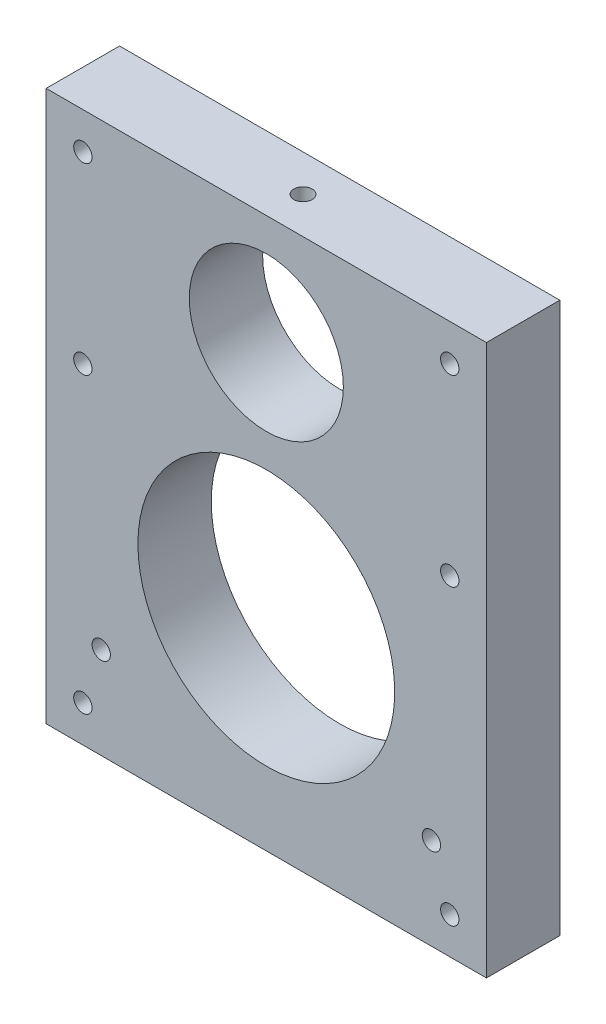
ISO-10303-21;
HEADER;
FILE_DESCRIPTION(('STEP AP214'),'2;1');
FILE_NAME('part.step','',(''),(''),'','','');
FILE_SCHEMA(('AUTOMOTIVE_DESIGN { 1 0 10303 214 1 1 1 1 }'));
ENDSEC;
DATA;
#1=APPLICATION_CONTEXT('core data for automotive mechanical design processes');
#2=APPLICATION_PROTOCOL_DEFINITION('international standard','automotive_design',2000,#1);
#3=PRODUCT_CONTEXT('',#1,'mechanical');
#4=PRODUCT('Part','Part','',(#3));
#5=PRODUCT_RELATED_PRODUCT_CATEGORY('part','',(#4));
#6=PRODUCT_DEFINITION_FORMATION('','',#4);
#7=PRODUCT_DEFINITION_CONTEXT('part definition',#1,'design');
#8=PRODUCT_DEFINITION('design','',#6,#7);
#9=PRODUCT_DEFINITION_SHAPE('','',#8);
#10=(LENGTH_UNIT() NAMED_UNIT(*) SI_UNIT(.MILLI.,.METRE.));
#11=(NAMED_UNIT(*) PLANE_ANGLE_UNIT() SI_UNIT($,.RADIAN.));
#12=(NAMED_UNIT(*) SI_UNIT($,.STERADIAN.) SOLID_ANGLE_UNIT());
#13=UNCERTAINTY_MEASURE_WITH_UNIT(LENGTH_MEASURE(1.E-05),#10,'distance_accuracy_value','');
#14=(GEOMETRIC_REPRESENTATION_CONTEXT(3) GLOBAL_UNCERTAINTY_ASSIGNED_CONTEXT((#13)) GLOBAL_UNIT_ASSIGNED_CONTEXT((#10,
#11,#12)) REPRESENTATION_CONTEXT('',''));
#15=CARTESIAN_POINT('',(0.,0.,0.));
#16=DIRECTION('',(0.,0.,1.));
#17=DIRECTION('',(1.,0.,0.));
#18=AXIS2_PLACEMENT_3D('',#15,#16,#17);
#19=CARTESIAN_POINT('',(-76.2,-95.2500000000001,25.4000000000002));
#20=DIRECTION('',(1.,0.,0.));
#21=DIRECTION('',(0.,0.,-1.));
#22=AXIS2_PLACEMENT_3D('',#19,#20,#21);
#23=PLANE('',#22);
#24=DIRECTION('',(0.,-1.,0.));
#25=VECTOR('',#24,1.);
#26=CARTESIAN_POINT('',(-76.2,-95.2500000000001,1.66533453693773E-13));
#27=LINE('',#26,#25);
#28=CARTESIAN_POINT('',(-76.2,95.2499999999999,2.77555756156289E-13));
#29=VERTEX_POINT('',#28);
#30=CARTESIAN_POINT('',(-76.2,-95.2500000000001,1.66533453693773E-13));
#31=VERTEX_POINT('',#30);
#32=EDGE_CURVE('E106',#29,#31,#27,.T.);
#33=ORIENTED_EDGE('',*,*,#32,.T.);
#34=DIRECTION('',(0.,0.,-1.));
#35=VECTOR('',#34,1.);
#36=CARTESIAN_POINT('',(-76.2,-95.2500000000001,25.4000000000002));
#37=LINE('',#36,#35);
#38=CARTESIAN_POINT('',(-76.2,-95.2500000000001,25.4000000000002));
#39=VERTEX_POINT('',#38);
#40=EDGE_CURVE('E11',#39,#31,#37,.T.);
#41=ORIENTED_EDGE('',*,*,#40,.F.);
#42=DIRECTION('',(0.,-1.,0.));
#43=VECTOR('',#42,1.);
#44=CARTESIAN_POINT('',(-76.2,-95.2500000000001,25.4000000000002));
#45=LINE('',#44,#43);
#46=CARTESIAN_POINT('',(-76.2,95.2499999999999,25.4000000000002));
#47=VERTEX_POINT('',#46);
#48=EDGE_CURVE('E93',#47,#39,#45,.T.);
#49=ORIENTED_EDGE('',*,*,#48,.F.);
#50=DIRECTION('',(0.,0.,-1.));
#51=VECTOR('',#50,1.);
#52=CARTESIAN_POINT('',(-76.2,95.2499999999999,25.4000000000002));
#53=LINE('',#52,#51);
#54=EDGE_CURVE('E102',#47,#29,#53,.T.);
#55=ORIENTED_EDGE('',*,*,#54,.T.);
#56=EDGE_LOOP('',(#33,#41,#49,#55));
#57=FACE_BOUND('',#56,.T.);
#58=ADVANCED_FACE('F36',(#57),#23,.F.);
#59=CARTESIAN_POINT('',(76.1999999999999,-95.2500000000002,25.4000000000001));
#60=DIRECTION('',(0.,1.,0.));
#61=DIRECTION('',(-1.,0.,0.));
#62=AXIS2_PLACEMENT_3D('',#59,#60,#61);
#63=PLANE('',#62);
#64=DIRECTION('',(1.,0.,0.));
#65=VECTOR('',#64,1.);
#66=CARTESIAN_POINT('',(76.2,-95.2500000000001,1.66533453693773E-13));
#67=LINE('',#66,#65);
#68=CARTESIAN_POINT('',(76.2,-95.2500000000001,1.66533453693773E-13));
#69=VERTEX_POINT('',#68);
#70=EDGE_CURVE('E97',#31,#69,#67,.T.);
#71=ORIENTED_EDGE('',*,*,#70,.T.);
#72=DIRECTION('',(0.,0.,-1.));
#73=VECTOR('',#72,1.);
#74=CARTESIAN_POINT('',(76.1999999999999,-95.2500000000002,25.4000000000001));
#75=LINE('',#74,#73);
#76=CARTESIAN_POINT('',(76.1999999999999,-95.2500000000002,25.4000000000001));
#77=VERTEX_POINT('',#76);
#78=EDGE_CURVE('E49',#77,#69,#75,.T.);
#79=ORIENTED_EDGE('',*,*,#78,.F.);
#80=DIRECTION('',(1.,0.,0.));
#81=VECTOR('',#80,1.);
#82=CARTESIAN_POINT('',(76.1999999999999,-95.2500000000002,25.4000000000001));
#83=LINE('',#82,#81);
#84=EDGE_CURVE('E88',#39,#77,#83,.T.);
#85=ORIENTED_EDGE('',*,*,#84,.F.);
#86=ORIENTED_EDGE('',*,*,#40,.T.);
#87=EDGE_LOOP('',(#71,#79,#85,#86));
#88=FACE_BOUND('',#87,.T.);
#89=ADVANCED_FACE('F96',(#88),#63,.F.);
#90=CARTESIAN_POINT('',(76.1999999999999,-95.2500000000002,25.4000000000001));
#91=DIRECTION('',(-1.,0.,0.));
#92=DIRECTION('',(0.,0.,1.));
#93=AXIS2_PLACEMENT_3D('',#90,#91,#92);
#94=PLANE('',#93);
#95=DIRECTION('',(0.,1.,0.));
#96=VECTOR('',#95,1.);
#97=CARTESIAN_POINT('',(76.2,-95.2500000000001,1.66533453693773E-13));
#98=LINE('',#97,#96);
#99=CARTESIAN_POINT('',(76.1999999999998,95.2499999999999,2.77555756156289E-13));
#100=VERTEX_POINT('',#99);
#101=EDGE_CURVE('E75',#69,#100,#98,.T.);
#102=ORIENTED_EDGE('',*,*,#101,.T.);
#103=DIRECTION('',(0.,0.,-1.));
#104=VECTOR('',#103,1.);
#105=CARTESIAN_POINT('',(76.1999999999999,95.2499999999998,25.4000000000001));
#106=LINE('',#105,#104);
#107=CARTESIAN_POINT('',(76.1999999999999,95.2499999999998,25.4000000000001));
#108=VERTEX_POINT('',#107);
#109=EDGE_CURVE('E98',#108,#100,#106,.T.);
#110=ORIENTED_EDGE('',*,*,#109,.F.);
#111=DIRECTION('',(0.,1.,0.));
#112=VECTOR('',#111,1.);
#113=CARTESIAN_POINT('',(76.1999999999999,-95.2500000000002,25.4000000000001));
#114=LINE('',#113,#112);
#115=EDGE_CURVE('E91',#77,#108,#114,.T.);
#116=ORIENTED_EDGE('',*,*,#115,.F.);
#117=ORIENTED_EDGE('',*,*,#78,.T.);
#118=EDGE_LOOP('',(#102,#110,#116,#117));
#119=FACE_BOUND('',#118,.T.);
#120=ADVANCED_FACE('F100',(#119),#94,.F.);
#121=CARTESIAN_POINT('',(76.1999999999999,95.2499999999998,25.4000000000001));
#122=DIRECTION('',(0.,-1.,0.));
#123=DIRECTION('',(1.,0.,0.));
#124=AXIS2_PLACEMENT_3D('',#121,#122,#123);
#125=PLANE('',#124);
#126=CARTESIAN_POINT('',(-1.11022302462516E-13,95.25,12.7000000000002));
#127=DIRECTION('',(0.,1.,0.));
#128=DIRECTION('',(-1.,0.,0.));
#129=AXIS2_PLACEMENT_3D('',#126,#127,#128);
#130=CIRCLE('',#129,3.175);
#131=CARTESIAN_POINT('',(-3.17500000000011,95.25,12.7000000000002));
#132=VERTEX_POINT('',#131);
#133=EDGE_CURVE('E305',#132,#132,#130,.T.);
#134=ORIENTED_EDGE('',*,*,#133,.F.);
#135=EDGE_LOOP('',(#134));
#136=FACE_BOUND('',#135,.T.);
#137=DIRECTION('',(-1.,0.,0.));
#138=VECTOR('',#137,1.);
#139=CARTESIAN_POINT('',(76.1999999999998,95.2499999999999,2.77555756156289E-13));
#140=LINE('',#139,#138);
#141=EDGE_CURVE('E81',#100,#29,#140,.T.);
#142=ORIENTED_EDGE('',*,*,#141,.T.);
#143=ORIENTED_EDGE('',*,*,#54,.F.);
#144=DIRECTION('',(-1.,0.,0.));
#145=VECTOR('',#144,1.);
#146=CARTESIAN_POINT('',(76.1999999999999,95.2499999999998,25.4000000000001));
#147=LINE('',#146,#145);
#148=EDGE_CURVE('E58',#108,#47,#147,.T.);
#149=ORIENTED_EDGE('',*,*,#148,.F.);
#150=ORIENTED_EDGE('',*,*,#109,.T.);
#151=EDGE_LOOP('',(#142,#143,#149,#150));
#152=FACE_BOUND('',#151,.T.);
#153=ADVANCED_FACE('F182',(#136,#152),#125,.F.);
#154=CARTESIAN_POINT('',(0.,0.,25.4000000000002));
#155=DIRECTION('',(0.,0.,1.));
#156=DIRECTION('',(1.,0.,0.));
#157=AXIS2_PLACEMENT_3D('',#154,#155,#156);
#158=PLANE('',#157);
#159=CARTESIAN_POINT('',(57.15,-63.5000000000002,25.4000000000002));
#160=DIRECTION('',(0.,0.,-1.));
#161=DIRECTION('',(-1.,0.,0.));
#162=AXIS2_PLACEMENT_3D('',#159,#160,#161);
#163=CIRCLE('',#162,3.175);
#164=CARTESIAN_POINT('',(53.975,-63.5000000000002,25.4000000000002));
#165=VERTEX_POINT('',#164);
#166=EDGE_CURVE('E144',#165,#165,#163,.T.);
#167=ORIENTED_EDGE('',*,*,#166,.T.);
#168=EDGE_LOOP('',(#167));
#169=FACE_BOUND('',#168,.T.);
#170=CARTESIAN_POINT('',(-57.1500000000001,-63.5000000000001,25.4000000000002));
#171=DIRECTION('',(0.,0.,-1.));
#172=DIRECTION('',(-1.,0.,0.));
#173=AXIS2_PLACEMENT_3D('',#170,#171,#172);
#174=CIRCLE('',#173,3.175);
#175=CARTESIAN_POINT('',(-60.3250000000001,-63.5000000000001,25.4000000000002));
#176=VERTEX_POINT('',#175);
#177=EDGE_CURVE('E308',#176,#176,#174,.T.);
#178=ORIENTED_EDGE('',*,*,#177,.T.);
#179=EDGE_LOOP('',(#178));
#180=FACE_BOUND('',#179,.T.);
#181=CARTESIAN_POINT('',(63.5,19.0499999999998,25.4000000000001));
#182=DIRECTION('',(0.,0.,-1.));
#183=DIRECTION('',(-1.,0.,0.));
#184=AXIS2_PLACEMENT_3D('',#181,#182,#183);
#185=CIRCLE('',#184,3.175);
#186=CARTESIAN_POINT('',(60.325,19.0499999999998,25.4000000000001));
#187=VERTEX_POINT('',#186);
#188=EDGE_CURVE('E138',#187,#187,#185,.T.);
#189=ORIENTED_EDGE('',*,*,#188,.T.);
#190=EDGE_LOOP('',(#189));
#191=FACE_BOUND('',#190,.T.);
#192=CARTESIAN_POINT('',(-63.5000000000001,19.0499999999999,25.4000000000001));
#193=DIRECTION('',(0.,0.,-1.));
#194=DIRECTION('',(-1.,0.,0.));
#195=AXIS2_PLACEMENT_3D('',#192,#193,#194);
#196=CIRCLE('',#195,3.175);
#197=CARTESIAN_POINT('',(-66.6750000000001,19.0499999999999,25.4000000000001));
#198=VERTEX_POINT('',#197);
#199=EDGE_CURVE('E146',#198,#198,#196,.T.);
#200=ORIENTED_EDGE('',*,*,#199,.T.);
#201=EDGE_LOOP('',(#200));
#202=FACE_BOUND('',#201,.T.);
#203=CARTESIAN_POINT('',(0.,-25.4,25.4000000000002));
#204=DIRECTION('',(0.,0.,-1.));
#205=DIRECTION('',(-1.,0.,0.));
#206=AXIS2_PLACEMENT_3D('',#203,#204,#205);
#207=CIRCLE('',#206,44.45);
#208=CARTESIAN_POINT('',(-44.45,-25.4,25.4000000000002));
#209=VERTEX_POINT('',#208);
#210=EDGE_CURVE('E133',#209,#209,#207,.T.);
#211=ORIENTED_EDGE('',*,*,#210,.T.);
#212=EDGE_LOOP('',(#211));
#213=FACE_BOUND('',#212,.T.);
#214=CARTESIAN_POINT('',(63.5,-82.5500000000001,25.4000000000002));
#215=DIRECTION('',(0.,0.,-1.));
#216=DIRECTION('',(-1.,0.,0.));
#217=AXIS2_PLACEMENT_3D('',#214,#215,#216);
#218=CIRCLE('',#217,3.175);
#219=CARTESIAN_POINT('',(60.325,-82.5500000000001,25.4000000000002));
#220=VERTEX_POINT('',#219);
#221=EDGE_CURVE('E132',#220,#220,#218,.T.);
#222=ORIENTED_EDGE('',*,*,#221,.T.);
#223=EDGE_LOOP('',(#222));
#224=FACE_BOUND('',#223,.T.);
#225=CARTESIAN_POINT('',(-63.5,-82.5500000000002,25.4000000000001));
#226=DIRECTION('',(0.,0.,-1.));
#227=DIRECTION('',(-1.,0.,0.));
#228=AXIS2_PLACEMENT_3D('',#225,#226,#227);
#229=CIRCLE('',#228,3.175);
#230=CARTESIAN_POINT('',(-66.675,-82.5500000000002,25.4000000000001));
#231=VERTEX_POINT('',#230);
#232=EDGE_CURVE('E162',#231,#231,#229,.T.);
#233=ORIENTED_EDGE('',*,*,#232,.T.);
#234=EDGE_LOOP('',(#233));
#235=FACE_BOUND('',#234,.T.);
#236=CARTESIAN_POINT('',(-63.5,82.5499999999998,25.4000000000001));
#237=DIRECTION('',(0.,0.,-1.));
#238=DIRECTION('',(-1.,0.,0.));
#239=AXIS2_PLACEMENT_3D('',#236,#237,#238);
#240=CIRCLE('',#239,3.175);
#241=CARTESIAN_POINT('',(-66.675,82.5499999999998,25.4000000000001));
#242=VERTEX_POINT('',#241);
#243=EDGE_CURVE('E159',#242,#242,#240,.T.);
#244=ORIENTED_EDGE('',*,*,#243,.T.);
#245=EDGE_LOOP('',(#244));
#246=FACE_BOUND('',#245,.T.);
#247=CARTESIAN_POINT('',(63.4999999999999,82.55,25.4000000000002));
#248=DIRECTION('',(0.,0.,-1.));
#249=DIRECTION('',(-1.,0.,0.));
#250=AXIS2_PLACEMENT_3D('',#247,#248,#249);
#251=CIRCLE('',#250,3.175);
#252=CARTESIAN_POINT('',(60.3249999999999,82.55,25.4000000000002));
#253=VERTEX_POINT('',#252);
#254=EDGE_CURVE('E119',#253,#253,#251,.T.);
#255=ORIENTED_EDGE('',*,*,#254,.T.);
#256=EDGE_LOOP('',(#255));
#257=FACE_BOUND('',#256,.T.);
#258=CARTESIAN_POINT('',(0.,57.1499999999999,25.4000000000002));
#259=DIRECTION('',(0.,0.,-1.));
#260=DIRECTION('',(-1.,0.,0.));
#261=AXIS2_PLACEMENT_3D('',#258,#259,#260);
#262=CIRCLE('',#261,26.67);
#263=CARTESIAN_POINT('',(-26.67,57.1499999999999,25.4000000000002));
#264=VERTEX_POINT('',#263);
#265=EDGE_CURVE('E109',#264,#264,#262,.T.);
#266=ORIENTED_EDGE('',*,*,#265,.T.);
#267=EDGE_LOOP('',(#266));
#268=FACE_BOUND('',#267,.T.);
#269=ORIENTED_EDGE('',*,*,#48,.T.);
#270=ORIENTED_EDGE('',*,*,#84,.T.);
#271=ORIENTED_EDGE('',*,*,#115,.T.);
#272=ORIENTED_EDGE('',*,*,#148,.T.);
#273=EDGE_LOOP('',(#269,#270,#271,#272));
#274=FACE_BOUND('',#273,.T.);
#275=ADVANCED_FACE('F89',(#169,#180,#191,#202,#213,#224,#235,#246,#257,#268,#274),#158,.T.);
#276=CARTESIAN_POINT('',(0.,0.,0.));
#277=DIRECTION('',(0.,0.,1.));
#278=DIRECTION('',(1.,0.,0.));
#279=AXIS2_PLACEMENT_3D('',#276,#277,#278);
#280=PLANE('',#279);
#281=CARTESIAN_POINT('',(57.15,-63.5,1.66533453693773E-13));
#282=DIRECTION('',(0.,0.,1.));
#283=DIRECTION('',(1.,0.,0.));
#284=AXIS2_PLACEMENT_3D('',#281,#282,#283);
#285=CIRCLE('',#284,3.175);
#286=CARTESIAN_POINT('',(60.325,-63.5,1.66533453693773E-13));
#287=VERTEX_POINT('',#286);
#288=EDGE_CURVE('E143',#287,#287,#285,.T.);
#289=ORIENTED_EDGE('',*,*,#288,.T.);
#290=EDGE_LOOP('',(#289));
#291=FACE_BOUND('',#290,.T.);
#292=CARTESIAN_POINT('',(-57.15,-63.5000000000001,1.66533453693773E-13));
#293=DIRECTION('',(0.,0.,1.));
#294=DIRECTION('',(1.,0.,0.));
#295=AXIS2_PLACEMENT_3D('',#292,#293,#294);
#296=CIRCLE('',#295,3.175);
#297=CARTESIAN_POINT('',(-53.975,-63.5000000000001,1.66533453693773E-13));
#298=VERTEX_POINT('',#297);
#299=EDGE_CURVE('E141',#298,#298,#296,.T.);
#300=ORIENTED_EDGE('',*,*,#299,.T.);
#301=EDGE_LOOP('',(#300));
#302=FACE_BOUND('',#301,.T.);
#303=CARTESIAN_POINT('',(63.5,19.05,2.77555756156289E-13));
#304=DIRECTION('',(0.,0.,1.));
#305=DIRECTION('',(1.,0.,0.));
#306=AXIS2_PLACEMENT_3D('',#303,#304,#305);
#307=CIRCLE('',#306,3.175);
#308=CARTESIAN_POINT('',(66.675,19.05,2.77555756156289E-13));
#309=VERTEX_POINT('',#308);
#310=EDGE_CURVE('E137',#309,#309,#307,.T.);
#311=ORIENTED_EDGE('',*,*,#310,.T.);
#312=EDGE_LOOP('',(#311));
#313=FACE_BOUND('',#312,.T.);
#314=CARTESIAN_POINT('',(-63.5000000000001,19.0499999999999,1.66533453693773E-13));
#315=DIRECTION('',(0.,0.,1.));
#316=DIRECTION('',(1.,0.,0.));
#317=AXIS2_PLACEMENT_3D('',#314,#315,#316);
#318=CIRCLE('',#317,3.175);
#319=CARTESIAN_POINT('',(-60.3250000000001,19.0499999999999,1.66533453693773E-13));
#320=VERTEX_POINT('',#319);
#321=EDGE_CURVE('E134',#320,#320,#318,.T.);
#322=ORIENTED_EDGE('',*,*,#321,.T.);
#323=EDGE_LOOP('',(#322));
#324=FACE_BOUND('',#323,.T.);
#325=CARTESIAN_POINT('',(0.,-25.4,1.66533453693773E-13));
#326=DIRECTION('',(0.,0.,1.));
#327=DIRECTION('',(1.,0.,0.));
#328=AXIS2_PLACEMENT_3D('',#325,#326,#327);
#329=CIRCLE('',#328,44.45);
#330=CARTESIAN_POINT('',(44.45,-25.4,1.66533453693773E-13));
#331=VERTEX_POINT('',#330);
#332=EDGE_CURVE('E129',#331,#331,#329,.T.);
#333=ORIENTED_EDGE('',*,*,#332,.T.);
#334=EDGE_LOOP('',(#333));
#335=FACE_BOUND('',#334,.T.);
#336=CARTESIAN_POINT('',(63.5,-82.55,2.77555756156289E-13));
#337=DIRECTION('',(0.,0.,1.));
#338=DIRECTION('',(1.,0.,0.));
#339=AXIS2_PLACEMENT_3D('',#336,#337,#338);
#340=CIRCLE('',#339,3.175);
#341=CARTESIAN_POINT('',(66.675,-82.55,2.77555756156289E-13));
#342=VERTEX_POINT('',#341);
#343=EDGE_CURVE('E125',#342,#342,#340,.T.);
#344=ORIENTED_EDGE('',*,*,#343,.T.);
#345=EDGE_LOOP('',(#344));
#346=FACE_BOUND('',#345,.T.);
#347=CARTESIAN_POINT('',(-63.5,-82.5500000000001,1.66533453693773E-13));
#348=DIRECTION('',(0.,0.,1.));
#349=DIRECTION('',(1.,0.,0.));
#350=AXIS2_PLACEMENT_3D('',#347,#348,#349);
#351=CIRCLE('',#350,3.175);
#352=CARTESIAN_POINT('',(-60.325,-82.5500000000001,1.66533453693773E-13));
#353=VERTEX_POINT('',#352);
#354=EDGE_CURVE('E122',#353,#353,#351,.T.);
#355=ORIENTED_EDGE('',*,*,#354,.T.);
#356=EDGE_LOOP('',(#355));
#357=FACE_BOUND('',#356,.T.);
#358=CARTESIAN_POINT('',(-63.5,82.5499999999999,1.66533453693773E-13));
#359=DIRECTION('',(0.,0.,1.));
#360=DIRECTION('',(1.,0.,0.));
#361=AXIS2_PLACEMENT_3D('',#358,#359,#360);
#362=CIRCLE('',#361,3.175);
#363=CARTESIAN_POINT('',(-60.325,82.5499999999999,1.66533453693773E-13));
#364=VERTEX_POINT('',#363);
#365=EDGE_CURVE('E118',#364,#364,#362,.T.);
#366=ORIENTED_EDGE('',*,*,#365,.T.);
#367=EDGE_LOOP('',(#366));
#368=FACE_BOUND('',#367,.T.);
#369=CARTESIAN_POINT('',(63.5,82.55,2.77555756156289E-13));
#370=DIRECTION('',(0.,0.,1.));
#371=DIRECTION('',(1.,0.,0.));
#372=AXIS2_PLACEMENT_3D('',#369,#370,#371);
#373=CIRCLE('',#372,3.175);
#374=CARTESIAN_POINT('',(66.675,82.55,2.77555756156289E-13));
#375=VERTEX_POINT('',#374);
#376=EDGE_CURVE('E115',#375,#375,#373,.T.);
#377=ORIENTED_EDGE('',*,*,#376,.T.);
#378=EDGE_LOOP('',(#377));
#379=FACE_BOUND('',#378,.T.);
#380=CARTESIAN_POINT('',(-1.66533453693773E-13,57.15,1.11022302462516E-13));
#381=DIRECTION('',(0.,0.,-1.));
#382=DIRECTION('',(-1.,0.,0.));
#383=AXIS2_PLACEMENT_3D('',#380,#381,#382);
#384=CIRCLE('',#383,26.67);
#385=CARTESIAN_POINT('',(-26.6700000000002,57.15,1.11022302462516E-13));
#386=VERTEX_POINT('',#385);
#387=EDGE_CURVE('E128',#386,#386,#384,.T.);
#388=ORIENTED_EDGE('',*,*,#387,.F.);
#389=EDGE_LOOP('',(#388));
#390=FACE_BOUND('',#389,.T.);
#391=ORIENTED_EDGE('',*,*,#32,.F.);
#392=ORIENTED_EDGE('',*,*,#141,.F.);
#393=ORIENTED_EDGE('',*,*,#101,.F.);
#394=ORIENTED_EDGE('',*,*,#70,.F.);
#395=EDGE_LOOP('',(#391,#392,#393,#394));
#396=FACE_BOUND('',#395,.T.);
#397=ADVANCED_FACE('F176',(#291,#302,#313,#324,#335,#346,#357,#368,#379,#390,#396),#280,.F.);
#398=CARTESIAN_POINT('',(0.,57.1499999999999,25.4000000000002));
#399=DIRECTION('',(0.,0.,-1.));
#400=DIRECTION('',(-1.,0.,0.));
#401=AXIS2_PLACEMENT_3D('',#398,#399,#400);
#402=CYLINDRICAL_SURFACE('',#401,26.67);
#403=CARTESIAN_POINT('',(-3.17500000000009,83.6303375167311,12.7000000000002));
#404=CARTESIAN_POINT('',(-3.17499240703098,83.6303399606806,12.877661858277));
#405=CARTESIAN_POINT('',(-3.16003770504258,83.6321447649333,13.055436419106));
#406=CARTESIAN_POINT('',(-3.10061416497908,83.639166697859,13.4060428628942));
#407=CARTESIAN_POINT('',(-3.05611405099566,83.6443874424614,13.5788693054731));
#408=CARTESIAN_POINT('',(-2.93892597021062,83.657641718425,13.9144522591081));
#409=CARTESIAN_POINT('',(-2.86625660694054,83.6656733930528,14.0772153341245));
#410=CARTESIAN_POINT('',(-2.69483167350498,83.6836423155757,14.3882042351501));
#411=CARTESIAN_POINT('',(-2.59608074825995,83.6935792240774,14.5364326432297));
#412=CARTESIAN_POINT('',(-2.37475712742661,83.7142956227051,14.8149305956053));
#413=CARTESIAN_POINT('',(-2.25207826742705,83.7250787349437,14.945115510182));
#414=CARTESIAN_POINT('',(-1.98660940114781,83.7462399140185,15.183100522154));
#415=CARTESIAN_POINT('',(-1.84381841613797,83.7566179611112,15.2908995295366));
#416=CARTESIAN_POINT('',(-1.54164960948835,83.7758364839069,15.4813538634817));
#417=CARTESIAN_POINT('',(-1.38222342192819,83.7846722646258,15.5639329682782));
#418=CARTESIAN_POINT('',(-1.05164353387014,83.7997709777511,15.7011153385699));
#419=CARTESIAN_POINT('',(-0.880490230146573,83.8060339971539,15.7557195500361));
#420=CARTESIAN_POINT('',(-0.532177979288458,83.8152560225247,15.8351502802648));
#421=CARTESIAN_POINT('',(-0.355051459910941,83.818230597955,15.8601171617314));
#422=CARTESIAN_POINT('',(0.000900718789805313,83.8205936977985,15.8799993397786));
#423=CARTESIAN_POINT('',(0.179726316907534,83.8199823509013,15.8749157147943));
#424=CARTESIAN_POINT('',(0.53304602059329,83.8152551218023,15.8349540450857));
#425=CARTESIAN_POINT('',(0.707557469921766,83.8111569951459,15.8002269493177));
#426=CARTESIAN_POINT('',(1.04825770221359,83.7999367198185,15.7021998696915));
#427=CARTESIAN_POINT('',(1.21444633946098,83.7928145182225,15.6388993857641));
#428=CARTESIAN_POINT('',(1.5342529681529,83.7763158708914,15.4853605935165));
#429=CARTESIAN_POINT('',(1.68783912099395,83.766933937884,15.3950565820007));
#430=CARTESIAN_POINT('',(1.97773369531483,83.7469662757228,15.1901219036999));
#431=CARTESIAN_POINT('',(2.11404139752019,83.7363804964895,15.0754902247235));
#432=CARTESIAN_POINT('',(2.36639593203603,83.715113202122,14.8243078293163));
#433=CARTESIAN_POINT('',(2.48231190549943,83.7044315003454,14.6876256196275));
#434=CARTESIAN_POINT('',(2.6895765348266,83.6842412085143,14.3966748514016));
#435=CARTESIAN_POINT('',(2.78092512601172,83.6747326215483,14.2424062465662));
#436=CARTESIAN_POINT('',(2.93646731916175,83.6579650625345,13.9205493503849));
#437=CARTESIAN_POINT('',(3.00065105875457,83.6507069077758,13.752956247681));
#438=CARTESIAN_POINT('',(3.09992879966566,83.6392782351232,13.4092654725679));
#439=CARTESIAN_POINT('',(3.1350240684756,83.6351075826963,13.2331681710717));
#440=CARTESIAN_POINT('',(3.17495662652864,83.6303504400145,12.8786216973988));
#441=CARTESIAN_POINT('',(3.17997779339179,83.6297421693262,12.7001935162926));
#442=CARTESIAN_POINT('',(3.16010419771107,83.6321210948219,12.3450384663615));
#443=CARTESIAN_POINT('',(3.1352100121586,83.6351082216599,12.1683115647894));
#444=CARTESIAN_POINT('',(3.05636693737727,83.6443215129981,11.8221228439868));
#445=CARTESIAN_POINT('',(3.00250654466448,83.6505378098922,11.6526405848311));
#446=CARTESIAN_POINT('',(2.86735085561387,83.6655010287347,11.3251137421287));
#447=CARTESIAN_POINT('',(2.78605468064882,83.6742480317272,11.1670695250806));
#448=CARTESIAN_POINT('',(2.59788083272169,83.6933394230464,10.8660715365026));
#449=CARTESIAN_POINT('',(2.49088225021646,83.7036912767678,10.7231938347023));
#450=CARTESIAN_POINT('',(2.25451241430762,83.7248022977348,10.4573595809633));
#451=CARTESIAN_POINT('',(2.12514037296675,83.7355614793149,10.3344037309179));
#452=CARTESIAN_POINT('',(1.84689418541496,83.7563414909184,10.1112605633183));
#453=CARTESIAN_POINT('',(1.69792297133147,83.7663582301121,10.011193848544));
#454=CARTESIAN_POINT('',(1.38518112810766,83.7844640088328,9.8375027808872));
#455=CARTESIAN_POINT('',(1.22141077337317,83.7925530840924,9.76387793784511));
#456=CARTESIAN_POINT('',(0.88412544119317,83.805873886518,9.64536105458621));
#457=CARTESIAN_POINT('',(0.710635526798093,83.8111126205644,9.60039850780944));
#458=CARTESIAN_POINT('',(0.35850247365322,83.8181714918164,9.54025296888379));
#459=CARTESIAN_POINT('',(0.179859544907955,83.8199917681376,9.52506876489149));
#460=CARTESIAN_POINT('',(-0.176329159458516,83.8200081259745,9.52493212220112));
#461=CARTESIAN_POINT('',(-0.35387489155898,83.81822653914,9.53979340069742));
#462=CARTESIAN_POINT('',(-0.703926883199497,83.8112836349338,9.59893233559879));
#463=CARTESIAN_POINT('',(-0.876433144060785,83.8061223184482,9.64320998429149));
#464=CARTESIAN_POINT('',(-1.21149077431278,83.7929975026063,9.75986799582566));
#465=CARTESIAN_POINT('',(-1.37404498006247,83.7850348060556,9.83224030805068));
#466=CARTESIAN_POINT('',(-1.68473006184615,83.7671904550277,10.0030139436667));
#467=CARTESIAN_POINT('',(-1.83286083137788,83.7573087863824,10.1014154592368));
#468=CARTESIAN_POINT('',(-2.11144691185336,83.7366573894587,10.3221463019496));
#469=CARTESIAN_POINT('',(-2.24179194329447,83.7258827323604,10.4446143594013));
#470=CARTESIAN_POINT('',(-2.48015568581761,83.7046998976965,10.7097160128711));
#471=CARTESIAN_POINT('',(-2.58816908568321,83.6942918078001,10.852354392521));
#472=CARTESIAN_POINT('',(-2.77912272499214,83.6749815897399,11.1543169927184));
#473=CARTESIAN_POINT('',(-2.86197360855385,83.6660848768524,11.3136980343918));
#474=CARTESIAN_POINT('',(-2.99961907720514,83.6508683653207,11.6441243922867));
#475=CARTESIAN_POINT('',(-3.05444446986604,83.6445457386255,11.8151566651729));
#476=CARTESIAN_POINT('',(-3.12121504334412,83.6367438729418,12.1059137892403));
#477=CARTESIAN_POINT('',(-3.14135577483975,83.6343532960217,12.2237977284998));
#478=CARTESIAN_POINT('',(-3.16825076182971,83.6311493013963,12.4611041296893));
#479=CARTESIAN_POINT('',(-3.17500510609313,83.6303358732326,12.5805265814116));
#480=CARTESIAN_POINT('',(-3.17500000000009,83.6303375167311,12.7000000000002));
#481=B_SPLINE_CURVE_WITH_KNOTS('',3,(#403,#404,#405,#406,#407,#408,#409,#410,#411,#412,#413,
#414,#415,#416,#417,#418,#419,#420,#421,#422,#423,#424,#425,#426,#427,#428,#429,#430,#431,#432,
#433,#434,#435,#436,#437,#438,#439,#440,#441,#442,#443,#444,#445,#446,#447,#448,#449,#450,#451,
#452,#453,#454,#455,#456,#457,#458,#459,#460,#461,#462,#463,#464,#465,#466,#467,#468,#469,#470,
#471,#472,#473,#474,#475,#476,#477,#478,#479,#480),.UNSPECIFIED.,.T.,.F.,(4,2,2,2,2,2,2,2,2,2,2,
2,2,2,2,2,2,2,2,2,2,2,2,2,2,2,2,2,2,2,2,2,2,2,2,2,2,2,4),(0.,0.53254916168726,1.06566296506407,
1.59842528769909,2.13109279347002,2.66617974798011,3.20129275079664,3.73800736883757,
4.27470383667694,4.8088482325085,5.34297345939178,5.87439495615807,6.40582575381125,
6.93856026306909,7.47131694194105,8.00737675556042,8.54343798045315,9.07969365918081,
9.61592597004753,10.1488763008415,10.6818163525379,11.2131373585097,11.7444753815802,
12.2783636432716,12.8122707110025,13.3489292603005,13.8855778609107,14.4209012097057,
14.9562027728176,15.4881956303179,16.0201883483405,16.5520287345294,17.0838730475157,
17.6188781765086,18.1540104017925,18.691021321386,19.2274406448138,19.5855697978793,
19.9436965760768),.UNSPECIFIED.);
#482=CARTESIAN_POINT('',(-3.17500000000009,83.6303375167311,12.7000000000002));
#483=VERTEX_POINT('',#482);
#484=EDGE_CURVE('E39',#483,#483,#481,.T.);
#485=ORIENTED_EDGE('',*,*,#484,.T.);
#486=EDGE_LOOP('',(#485));
#487=FACE_BOUND('',#486,.T.);
#488=ORIENTED_EDGE('',*,*,#265,.F.);
#489=EDGE_LOOP('',(#488));
#490=FACE_BOUND('',#489,.T.);
#491=ORIENTED_EDGE('',*,*,#387,.T.);
#492=EDGE_LOOP('',(#491));
#493=FACE_BOUND('',#492,.T.);
#494=ADVANCED_FACE('F174',(#487,#490,#493),#402,.F.);
#495=CARTESIAN_POINT('',(63.4999999999999,82.55,25.4000000000002));
#496=DIRECTION('',(0.,0.,-1.));
#497=DIRECTION('',(-1.,0.,0.));
#498=AXIS2_PLACEMENT_3D('',#495,#496,#497);
#499=CYLINDRICAL_SURFACE('',#498,3.175);
#500=ORIENTED_EDGE('',*,*,#254,.F.);
#501=EDGE_LOOP('',(#500));
#502=FACE_BOUND('',#501,.T.);
#503=ORIENTED_EDGE('',*,*,#376,.F.);
#504=EDGE_LOOP('',(#503));
#505=FACE_BOUND('',#504,.T.);
#506=ADVANCED_FACE('F221',(#502,#505),#499,.F.);
#507=CARTESIAN_POINT('',(-63.5,82.5499999999998,25.4000000000001));
#508=DIRECTION('',(0.,0.,-1.));
#509=DIRECTION('',(-1.,0.,0.));
#510=AXIS2_PLACEMENT_3D('',#507,#508,#509);
#511=CYLINDRICAL_SURFACE('',#510,3.175);
#512=ORIENTED_EDGE('',*,*,#243,.F.);
#513=EDGE_LOOP('',(#512));
#514=FACE_BOUND('',#513,.T.);
#515=ORIENTED_EDGE('',*,*,#365,.F.);
#516=EDGE_LOOP('',(#515));
#517=FACE_BOUND('',#516,.T.);
#518=ADVANCED_FACE('F228',(#514,#517),#511,.F.);
#519=CARTESIAN_POINT('',(-63.5,-82.5500000000002,25.4000000000001));
#520=DIRECTION('',(0.,0.,-1.));
#521=DIRECTION('',(-1.,0.,0.));
#522=AXIS2_PLACEMENT_3D('',#519,#520,#521);
#523=CYLINDRICAL_SURFACE('',#522,3.175);
#524=ORIENTED_EDGE('',*,*,#232,.F.);
#525=EDGE_LOOP('',(#524));
#526=FACE_BOUND('',#525,.T.);
#527=ORIENTED_EDGE('',*,*,#354,.F.);
#528=EDGE_LOOP('',(#527));
#529=FACE_BOUND('',#528,.T.);
#530=ADVANCED_FACE('F236',(#526,#529),#523,.F.);
#531=CARTESIAN_POINT('',(63.5,-82.5500000000001,25.4000000000002));
#532=DIRECTION('',(0.,0.,-1.));
#533=DIRECTION('',(-1.,0.,0.));
#534=AXIS2_PLACEMENT_3D('',#531,#532,#533);
#535=CYLINDRICAL_SURFACE('',#534,3.175);
#536=ORIENTED_EDGE('',*,*,#221,.F.);
#537=EDGE_LOOP('',(#536));
#538=FACE_BOUND('',#537,.T.);
#539=ORIENTED_EDGE('',*,*,#343,.F.);
#540=EDGE_LOOP('',(#539));
#541=FACE_BOUND('',#540,.T.);
#542=ADVANCED_FACE('F244',(#538,#541),#535,.F.);
#543=CARTESIAN_POINT('',(0.,-25.4,25.4000000000002));
#544=DIRECTION('',(0.,0.,-1.));
#545=DIRECTION('',(-1.,0.,0.));
#546=AXIS2_PLACEMENT_3D('',#543,#544,#545);
#547=CYLINDRICAL_SURFACE('',#546,44.45);
#548=ORIENTED_EDGE('',*,*,#210,.F.);
#549=EDGE_LOOP('',(#548));
#550=FACE_BOUND('',#549,.T.);
#551=ORIENTED_EDGE('',*,*,#332,.F.);
#552=EDGE_LOOP('',(#551));
#553=FACE_BOUND('',#552,.T.);
#554=ADVANCED_FACE('F252',(#550,#553),#547,.F.);
#555=CARTESIAN_POINT('',(-63.5000000000001,19.0499999999999,25.4000000000001));
#556=DIRECTION('',(0.,0.,-1.));
#557=DIRECTION('',(-1.,0.,0.));
#558=AXIS2_PLACEMENT_3D('',#555,#556,#557);
#559=CYLINDRICAL_SURFACE('',#558,3.175);
#560=ORIENTED_EDGE('',*,*,#199,.F.);
#561=EDGE_LOOP('',(#560));
#562=FACE_BOUND('',#561,.T.);
#563=ORIENTED_EDGE('',*,*,#321,.F.);
#564=EDGE_LOOP('',(#563));
#565=FACE_BOUND('',#564,.T.);
#566=ADVANCED_FACE('F260',(#562,#565),#559,.F.);
#567=CARTESIAN_POINT('',(63.5,19.0499999999998,25.4000000000001));
#568=DIRECTION('',(0.,0.,-1.));
#569=DIRECTION('',(-1.,0.,0.));
#570=AXIS2_PLACEMENT_3D('',#567,#568,#569);
#571=CYLINDRICAL_SURFACE('',#570,3.175);
#572=ORIENTED_EDGE('',*,*,#188,.F.);
#573=EDGE_LOOP('',(#572));
#574=FACE_BOUND('',#573,.T.);
#575=ORIENTED_EDGE('',*,*,#310,.F.);
#576=EDGE_LOOP('',(#575));
#577=FACE_BOUND('',#576,.T.);
#578=ADVANCED_FACE('F268',(#574,#577),#571,.F.);
#579=CARTESIAN_POINT('',(-57.1500000000001,-63.5000000000001,25.4000000000002));
#580=DIRECTION('',(0.,0.,-1.));
#581=DIRECTION('',(-1.,0.,0.));
#582=AXIS2_PLACEMENT_3D('',#579,#580,#581);
#583=CYLINDRICAL_SURFACE('',#582,3.175);
#584=ORIENTED_EDGE('',*,*,#177,.F.);
#585=EDGE_LOOP('',(#584));
#586=FACE_BOUND('',#585,.T.);
#587=ORIENTED_EDGE('',*,*,#299,.F.);
#588=EDGE_LOOP('',(#587));
#589=FACE_BOUND('',#588,.T.);
#590=ADVANCED_FACE('F276',(#586,#589),#583,.F.);
#591=CARTESIAN_POINT('',(57.15,-63.5000000000002,25.4000000000002));
#592=DIRECTION('',(0.,0.,-1.));
#593=DIRECTION('',(-1.,0.,0.));
#594=AXIS2_PLACEMENT_3D('',#591,#592,#593);
#595=CYLINDRICAL_SURFACE('',#594,3.175);
#596=ORIENTED_EDGE('',*,*,#166,.F.);
#597=EDGE_LOOP('',(#596));
#598=FACE_BOUND('',#597,.T.);
#599=ORIENTED_EDGE('',*,*,#288,.F.);
#600=EDGE_LOOP('',(#599));
#601=FACE_BOUND('',#600,.T.);
#602=ADVANCED_FACE('F284',(#598,#601),#595,.F.);
#603=CARTESIAN_POINT('',(0.,69.85,12.7000000000001));
#604=DIRECTION('',(0.,1.,0.));
#605=DIRECTION('',(-1.,0.,0.));
#606=AXIS2_PLACEMENT_3D('',#603,#604,#605);
#607=CYLINDRICAL_SURFACE('',#606,3.175);
#608=ORIENTED_EDGE('',*,*,#133,.T.);
#609=EDGE_LOOP('',(#608));
#610=FACE_BOUND('',#609,.T.);
#611=ORIENTED_EDGE('',*,*,#484,.F.);
#612=EDGE_LOOP('',(#611));
#613=FACE_BOUND('',#612,.T.);
#614=ADVANCED_FACE('F292',(#610,#613),#607,.F.);
#615=CLOSED_SHELL('',(#58,#89,#120,#153,#275,#397,#494,#506,#518,#530,#542,#554,#566,#578,#590,
#602,#614));
#616=MANIFOLD_SOLID_BREP('B2',#615);
#617=ADVANCED_BREP_SHAPE_REPRESENTATION('',(#18,#616),#14);
#618=SHAPE_DEFINITION_REPRESENTATION(#9,#617);
ENDSEC;
END-ISO-10303-21;
